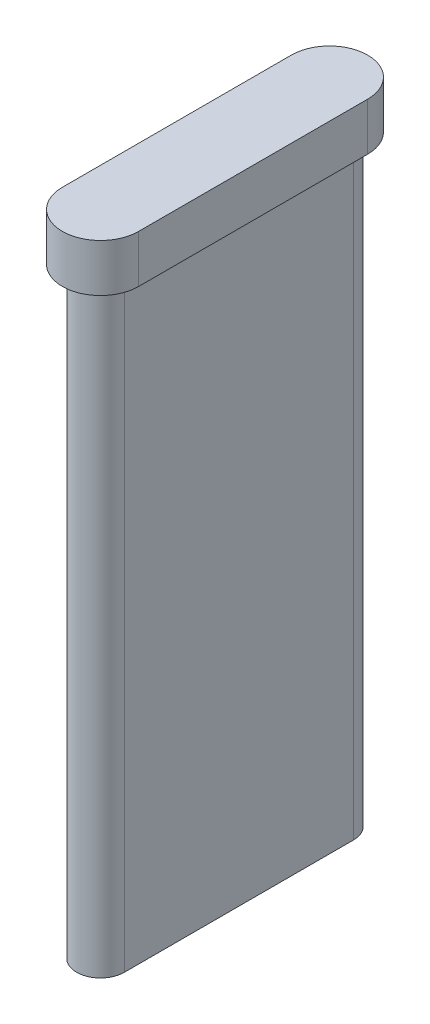
ISO-10303-21;
HEADER;
FILE_DESCRIPTION(('STEP AP214'),'2;1');
FILE_NAME('part.step','',(''),(''),'','','');
FILE_SCHEMA(('AUTOMOTIVE_DESIGN { 1 0 10303 214 1 1 1 1 }'));
ENDSEC;
DATA;
#1=APPLICATION_CONTEXT('core data for automotive mechanical design processes');
#2=APPLICATION_PROTOCOL_DEFINITION('international standard','automotive_design',2000,#1);
#3=PRODUCT_CONTEXT('',#1,'mechanical');
#4=PRODUCT('Part','Part','',(#3));
#5=PRODUCT_RELATED_PRODUCT_CATEGORY('part','',(#4));
#6=PRODUCT_DEFINITION_FORMATION('','',#4);
#7=PRODUCT_DEFINITION_CONTEXT('part definition',#1,'design');
#8=PRODUCT_DEFINITION('design','',#6,#7);
#9=PRODUCT_DEFINITION_SHAPE('','',#8);
#10=(LENGTH_UNIT() NAMED_UNIT(*) SI_UNIT(.MILLI.,.METRE.));
#11=(NAMED_UNIT(*) PLANE_ANGLE_UNIT() SI_UNIT($,.RADIAN.));
#12=(NAMED_UNIT(*) SI_UNIT($,.STERADIAN.) SOLID_ANGLE_UNIT());
#13=UNCERTAINTY_MEASURE_WITH_UNIT(LENGTH_MEASURE(1.E-05),#10,'distance_accuracy_value','');
#14=(GEOMETRIC_REPRESENTATION_CONTEXT(3) GLOBAL_UNCERTAINTY_ASSIGNED_CONTEXT((#13)) GLOBAL_UNIT_ASSIGNED_CONTEXT((#10,
#11,#12)) REPRESENTATION_CONTEXT('',''));
#15=CARTESIAN_POINT('',(0.,0.,0.));
#16=DIRECTION('',(0.,0.,1.));
#17=DIRECTION('',(1.,0.,0.));
#18=AXIS2_PLACEMENT_3D('',#15,#16,#17);
#19=CARTESIAN_POINT('',(0.,-68.,12.));
#20=DIRECTION('',(0.,1.,0.));
#21=DIRECTION('',(0.,0.,1.));
#22=AXIS2_PLACEMENT_3D('',#19,#20,#21);
#23=CYLINDRICAL_SURFACE('',#22,2.50000000000001);
#24=DIRECTION('',(0.,1.,0.));
#25=VECTOR('',#24,1.);
#26=CARTESIAN_POINT('',(2.50000000000001,-68.,12.));
#27=LINE('',#26,#25);
#28=CARTESIAN_POINT('',(2.50000000000001,-68.,12.));
#29=VERTEX_POINT('',#28);
#30=CARTESIAN_POINT('',(2.50000000000001,-5.,12.));
#31=VERTEX_POINT('',#30);
#32=EDGE_CURVE('E162',#29,#31,#27,.T.);
#33=ORIENTED_EDGE('',*,*,#32,.T.);
#34=CARTESIAN_POINT('',(0.,-5.,12.));
#35=DIRECTION('',(0.,1.,0.));
#36=DIRECTION('',(0.,0.,1.));
#37=AXIS2_PLACEMENT_3D('',#34,#35,#36);
#38=CIRCLE('',#37,2.50000000000001);
#39=CARTESIAN_POINT('',(-2.50000000000001,-5.,12.));
#40=VERTEX_POINT('',#39);
#41=EDGE_CURVE('E53',#31,#40,#38,.F.);
#42=ORIENTED_EDGE('',*,*,#41,.T.);
#43=DIRECTION('',(0.,1.,0.));
#44=VECTOR('',#43,1.);
#45=CARTESIAN_POINT('',(-2.50000000000001,-68.,12.));
#46=LINE('',#45,#44);
#47=CARTESIAN_POINT('',(-2.50000000000001,-68.,12.));
#48=VERTEX_POINT('',#47);
#49=EDGE_CURVE('E46',#48,#40,#46,.T.);
#50=ORIENTED_EDGE('',*,*,#49,.F.);
#51=CARTESIAN_POINT('',(0.,-68.,12.));
#52=DIRECTION('',(0.,1.,0.));
#53=DIRECTION('',(0.,0.,1.));
#54=AXIS2_PLACEMENT_3D('',#51,#52,#53);
#55=CIRCLE('',#54,2.50000000000001);
#56=EDGE_CURVE('E151',#48,#29,#55,.T.);
#57=ORIENTED_EDGE('',*,*,#56,.T.);
#58=EDGE_LOOP('',(#33,#42,#50,#57));
#59=FACE_BOUND('',#58,.T.);
#60=ADVANCED_FACE('F39',(#59),#23,.T.);
#61=CARTESIAN_POINT('',(-2.50000000000001,-68.,12.));
#62=DIRECTION('',(-1.,0.,0.));
#63=DIRECTION('',(0.,0.,1.));
#64=AXIS2_PLACEMENT_3D('',#61,#62,#63);
#65=PLANE('',#64);
#66=ORIENTED_EDGE('',*,*,#49,.T.);
#67=DIRECTION('',(0.,0.,-1.));
#68=VECTOR('',#67,1.);
#69=CARTESIAN_POINT('',(-2.50000000000001,-5.,12.));
#70=LINE('',#69,#68);
#71=CARTESIAN_POINT('',(-2.50000000000001,-5.,-12.));
#72=VERTEX_POINT('',#71);
#73=EDGE_CURVE('E147',#40,#72,#70,.T.);
#74=ORIENTED_EDGE('',*,*,#73,.T.);
#75=DIRECTION('',(0.,1.,0.));
#76=VECTOR('',#75,1.);
#77=CARTESIAN_POINT('',(-2.50000000000001,-68.,-12.));
#78=LINE('',#77,#76);
#79=CARTESIAN_POINT('',(-2.50000000000001,-68.,-12.));
#80=VERTEX_POINT('',#79);
#81=EDGE_CURVE('E164',#80,#72,#78,.T.);
#82=ORIENTED_EDGE('',*,*,#81,.F.);
#83=DIRECTION('',(0.,0.,1.));
#84=VECTOR('',#83,1.);
#85=CARTESIAN_POINT('',(-2.50000000000001,-68.,12.));
#86=LINE('',#85,#84);
#87=EDGE_CURVE('E159',#80,#48,#86,.T.);
#88=ORIENTED_EDGE('',*,*,#87,.T.);
#89=EDGE_LOOP('',(#66,#74,#82,#88));
#90=FACE_BOUND('',#89,.T.);
#91=ADVANCED_FACE('F180',(#90),#65,.T.);
#92=CARTESIAN_POINT('',(0.,-68.,-12.));
#93=DIRECTION('',(0.,1.,0.));
#94=DIRECTION('',(0.,0.,1.));
#95=AXIS2_PLACEMENT_3D('',#92,#93,#94);
#96=CYLINDRICAL_SURFACE('',#95,2.50000000000001);
#97=ORIENTED_EDGE('',*,*,#81,.T.);
#98=CARTESIAN_POINT('',(0.,-5.,-12.));
#99=DIRECTION('',(0.,1.,0.));
#100=DIRECTION('',(0.,0.,1.));
#101=AXIS2_PLACEMENT_3D('',#98,#99,#100);
#102=CIRCLE('',#101,2.50000000000001);
#103=CARTESIAN_POINT('',(2.5,-5.,-12.));
#104=VERTEX_POINT('',#103);
#105=EDGE_CURVE('E141',#72,#104,#102,.F.);
#106=ORIENTED_EDGE('',*,*,#105,.T.);
#107=DIRECTION('',(0.,1.,0.));
#108=VECTOR('',#107,1.);
#109=CARTESIAN_POINT('',(2.50000000000001,-68.,-12.));
#110=LINE('',#109,#108);
#111=CARTESIAN_POINT('',(2.50000000000001,-68.,-12.));
#112=VERTEX_POINT('',#111);
#113=EDGE_CURVE('E167',#112,#104,#110,.T.);
#114=ORIENTED_EDGE('',*,*,#113,.F.);
#115=CARTESIAN_POINT('',(0.,-68.,-12.));
#116=DIRECTION('',(0.,1.,0.));
#117=DIRECTION('',(0.,0.,1.));
#118=AXIS2_PLACEMENT_3D('',#115,#116,#117);
#119=CIRCLE('',#118,2.50000000000001);
#120=EDGE_CURVE('E156',#112,#80,#119,.T.);
#121=ORIENTED_EDGE('',*,*,#120,.T.);
#122=EDGE_LOOP('',(#97,#106,#114,#121));
#123=FACE_BOUND('',#122,.T.);
#124=ADVANCED_FACE('F178',(#123),#96,.T.);
#125=CARTESIAN_POINT('',(2.50000000000001,-68.,12.));
#126=DIRECTION('',(1.,0.,0.));
#127=DIRECTION('',(0.,0.,-1.));
#128=AXIS2_PLACEMENT_3D('',#125,#126,#127);
#129=PLANE('',#128);
#130=ORIENTED_EDGE('',*,*,#113,.T.);
#131=DIRECTION('',(0.,0.,1.));
#132=VECTOR('',#131,1.);
#133=CARTESIAN_POINT('',(2.50000000000001,-5.,12.));
#134=LINE('',#133,#132);
#135=EDGE_CURVE('E11',#104,#31,#134,.T.);
#136=ORIENTED_EDGE('',*,*,#135,.T.);
#137=ORIENTED_EDGE('',*,*,#32,.F.);
#138=DIRECTION('',(0.,0.,-1.));
#139=VECTOR('',#138,1.);
#140=CARTESIAN_POINT('',(2.50000000000001,-68.,12.));
#141=LINE('',#140,#139);
#142=EDGE_CURVE('E153',#29,#112,#141,.T.);
#143=ORIENTED_EDGE('',*,*,#142,.T.);
#144=EDGE_LOOP('',(#130,#136,#137,#143));
#145=FACE_BOUND('',#144,.T.);
#146=ADVANCED_FACE('F172',(#145),#129,.T.);
#147=CARTESIAN_POINT('',(0.,-68.,12.));
#148=DIRECTION('',(0.,1.,0.));
#149=DIRECTION('',(0.,0.,1.));
#150=AXIS2_PLACEMENT_3D('',#147,#148,#149);
#151=PLANE('',#150);
#152=ORIENTED_EDGE('',*,*,#56,.F.);
#153=ORIENTED_EDGE('',*,*,#87,.F.);
#154=ORIENTED_EDGE('',*,*,#120,.F.);
#155=ORIENTED_EDGE('',*,*,#142,.F.);
#156=EDGE_LOOP('',(#152,#153,#154,#155));
#157=FACE_BOUND('',#156,.T.);
#158=ADVANCED_FACE('F175',(#157),#151,.F.);
#159=CARTESIAN_POINT('',(0.,-5.,12.));
#160=DIRECTION('',(0.,1.,0.));
#161=DIRECTION('',(0.,0.,1.));
#162=AXIS2_PLACEMENT_3D('',#159,#160,#161);
#163=CYLINDRICAL_SURFACE('',#162,4.00000000000001);
#164=CARTESIAN_POINT('',(0.,0.,12.));
#165=DIRECTION('',(0.,1.,0.));
#166=DIRECTION('',(0.,0.,1.));
#167=AXIS2_PLACEMENT_3D('',#164,#165,#166);
#168=CIRCLE('',#167,4.00000000000001);
#169=CARTESIAN_POINT('',(-4.00000000000001,0.,12.));
#170=VERTEX_POINT('',#169);
#171=CARTESIAN_POINT('',(4.00000000000001,0.,12.));
#172=VERTEX_POINT('',#171);
#173=EDGE_CURVE('E135',#170,#172,#168,.T.);
#174=ORIENTED_EDGE('',*,*,#173,.F.);
#175=DIRECTION('',(0.,1.,0.));
#176=VECTOR('',#175,1.);
#177=CARTESIAN_POINT('',(-4.00000000000001,-5.,12.));
#178=LINE('',#177,#176);
#179=CARTESIAN_POINT('',(-4.00000000000001,-5.,12.));
#180=VERTEX_POINT('',#179);
#181=EDGE_CURVE('E126',#180,#170,#178,.T.);
#182=ORIENTED_EDGE('',*,*,#181,.F.);
#183=CARTESIAN_POINT('',(0.,-5.,12.));
#184=DIRECTION('',(0.,1.,0.));
#185=DIRECTION('',(0.,0.,1.));
#186=AXIS2_PLACEMENT_3D('',#183,#184,#185);
#187=CIRCLE('',#186,4.00000000000001);
#188=CARTESIAN_POINT('',(4.00000000000001,-5.,12.));
#189=VERTEX_POINT('',#188);
#190=EDGE_CURVE('E120',#180,#189,#187,.T.);
#191=ORIENTED_EDGE('',*,*,#190,.T.);
#192=DIRECTION('',(0.,1.,0.));
#193=VECTOR('',#192,1.);
#194=CARTESIAN_POINT('',(4.00000000000001,-5.,12.));
#195=LINE('',#194,#193);
#196=EDGE_CURVE('E102',#189,#172,#195,.T.);
#197=ORIENTED_EDGE('',*,*,#196,.T.);
#198=EDGE_LOOP('',(#174,#182,#191,#197));
#199=FACE_BOUND('',#198,.T.);
#200=ADVANCED_FACE('F125',(#199),#163,.T.);
#201=CARTESIAN_POINT('',(-4.00000000000001,-5.,-12.));
#202=DIRECTION('',(-1.,0.,0.));
#203=DIRECTION('',(0.,0.,1.));
#204=AXIS2_PLACEMENT_3D('',#201,#202,#203);
#205=PLANE('',#204);
#206=DIRECTION('',(0.,0.,1.));
#207=VECTOR('',#206,1.);
#208=CARTESIAN_POINT('',(-4.00000000000001,0.,-12.));
#209=LINE('',#208,#207);
#210=CARTESIAN_POINT('',(-4.00000000000001,0.,-12.));
#211=VERTEX_POINT('',#210);
#212=EDGE_CURVE('E127',#211,#170,#209,.T.);
#213=ORIENTED_EDGE('',*,*,#212,.F.);
#214=DIRECTION('',(0.,1.,0.));
#215=VECTOR('',#214,1.);
#216=CARTESIAN_POINT('',(-4.00000000000001,-5.,-12.));
#217=LINE('',#216,#215);
#218=CARTESIAN_POINT('',(-4.00000000000001,-5.,-12.));
#219=VERTEX_POINT('',#218);
#220=EDGE_CURVE('E142',#219,#211,#217,.T.);
#221=ORIENTED_EDGE('',*,*,#220,.F.);
#222=DIRECTION('',(0.,0.,1.));
#223=VECTOR('',#222,1.);
#224=CARTESIAN_POINT('',(-4.00000000000001,-5.,-12.));
#225=LINE('',#224,#223);
#226=EDGE_CURVE('E113',#219,#180,#225,.T.);
#227=ORIENTED_EDGE('',*,*,#226,.T.);
#228=ORIENTED_EDGE('',*,*,#181,.T.);
#229=EDGE_LOOP('',(#213,#221,#227,#228));
#230=FACE_BOUND('',#229,.T.);
#231=ADVANCED_FACE('F198',(#230),#205,.T.);
#232=CARTESIAN_POINT('',(0.,-5.,-12.));
#233=DIRECTION('',(0.,1.,0.));
#234=DIRECTION('',(0.,0.,1.));
#235=AXIS2_PLACEMENT_3D('',#232,#233,#234);
#236=CYLINDRICAL_SURFACE('',#235,4.00000000000001);
#237=CARTESIAN_POINT('',(0.,0.,-12.));
#238=DIRECTION('',(0.,1.,0.));
#239=DIRECTION('',(0.,0.,1.));
#240=AXIS2_PLACEMENT_3D('',#237,#238,#239);
#241=CIRCLE('',#240,4.00000000000001);
#242=CARTESIAN_POINT('',(4.00000000000001,0.,-12.));
#243=VERTEX_POINT('',#242);
#244=EDGE_CURVE('E130',#243,#211,#241,.T.);
#245=ORIENTED_EDGE('',*,*,#244,.F.);
#246=DIRECTION('',(0.,1.,0.));
#247=VECTOR('',#246,1.);
#248=CARTESIAN_POINT('',(4.00000000000001,-5.,-12.));
#249=LINE('',#248,#247);
#250=CARTESIAN_POINT('',(4.00000000000001,-5.,-12.));
#251=VERTEX_POINT('',#250);
#252=EDGE_CURVE('E112',#251,#243,#249,.T.);
#253=ORIENTED_EDGE('',*,*,#252,.F.);
#254=CARTESIAN_POINT('',(0.,-5.,-12.));
#255=DIRECTION('',(0.,1.,0.));
#256=DIRECTION('',(0.,0.,1.));
#257=AXIS2_PLACEMENT_3D('',#254,#255,#256);
#258=CIRCLE('',#257,4.00000000000001);
#259=EDGE_CURVE('E123',#251,#219,#258,.T.);
#260=ORIENTED_EDGE('',*,*,#259,.T.);
#261=ORIENTED_EDGE('',*,*,#220,.T.);
#262=EDGE_LOOP('',(#245,#253,#260,#261));
#263=FACE_BOUND('',#262,.T.);
#264=ADVANCED_FACE('F203',(#263),#236,.T.);
#265=CARTESIAN_POINT('',(4.00000000000001,-5.,12.));
#266=DIRECTION('',(1.,0.,0.));
#267=DIRECTION('',(0.,0.,-1.));
#268=AXIS2_PLACEMENT_3D('',#265,#266,#267);
#269=PLANE('',#268);
#270=DIRECTION('',(0.,0.,-1.));
#271=VECTOR('',#270,1.);
#272=CARTESIAN_POINT('',(4.00000000000001,0.,12.));
#273=LINE('',#272,#271);
#274=EDGE_CURVE('E107',#172,#243,#273,.T.);
#275=ORIENTED_EDGE('',*,*,#274,.F.);
#276=ORIENTED_EDGE('',*,*,#196,.F.);
#277=DIRECTION('',(0.,0.,-1.));
#278=VECTOR('',#277,1.);
#279=CARTESIAN_POINT('',(4.00000000000001,-5.,12.));
#280=LINE('',#279,#278);
#281=EDGE_CURVE('E105',#189,#251,#280,.T.);
#282=ORIENTED_EDGE('',*,*,#281,.T.);
#283=ORIENTED_EDGE('',*,*,#252,.T.);
#284=EDGE_LOOP('',(#275,#276,#282,#283));
#285=FACE_BOUND('',#284,.T.);
#286=ADVANCED_FACE('F104',(#285),#269,.T.);
#287=CARTESIAN_POINT('',(0.,-5.,12.));
#288=DIRECTION('',(0.,1.,0.));
#289=DIRECTION('',(0.,0.,1.));
#290=AXIS2_PLACEMENT_3D('',#287,#288,#289);
#291=PLANE('',#290);
#292=ORIENTED_EDGE('',*,*,#41,.F.);
#293=ORIENTED_EDGE('',*,*,#135,.F.);
#294=ORIENTED_EDGE('',*,*,#105,.F.);
#295=ORIENTED_EDGE('',*,*,#73,.F.);
#296=EDGE_LOOP('',(#292,#293,#294,#295));
#297=FACE_BOUND('',#296,.T.);
#298=ORIENTED_EDGE('',*,*,#190,.F.);
#299=ORIENTED_EDGE('',*,*,#226,.F.);
#300=ORIENTED_EDGE('',*,*,#259,.F.);
#301=ORIENTED_EDGE('',*,*,#281,.F.);
#302=EDGE_LOOP('',(#298,#299,#300,#301));
#303=FACE_BOUND('',#302,.T.);
#304=ADVANCED_FACE('F118',(#297,#303),#291,.F.);
#305=CARTESIAN_POINT('',(0.,0.,12.));
#306=DIRECTION('',(0.,1.,0.));
#307=DIRECTION('',(0.,0.,1.));
#308=AXIS2_PLACEMENT_3D('',#305,#306,#307);
#309=PLANE('',#308);
#310=ORIENTED_EDGE('',*,*,#173,.T.);
#311=ORIENTED_EDGE('',*,*,#274,.T.);
#312=ORIENTED_EDGE('',*,*,#244,.T.);
#313=ORIENTED_EDGE('',*,*,#212,.T.);
#314=EDGE_LOOP('',(#310,#311,#312,#313));
#315=FACE_BOUND('',#314,.T.);
#316=ADVANCED_FACE('F189',(#315),#309,.T.);
#317=CLOSED_SHELL('',(#60,#91,#124,#146,#158,#200,#231,#264,#286,#304,#316));
#318=MANIFOLD_SOLID_BREP('B2',#317);
#319=ADVANCED_BREP_SHAPE_REPRESENTATION('',(#18,#318),#14);
#320=SHAPE_DEFINITION_REPRESENTATION(#9,#319);
ENDSEC;
END-ISO-10303-21;
